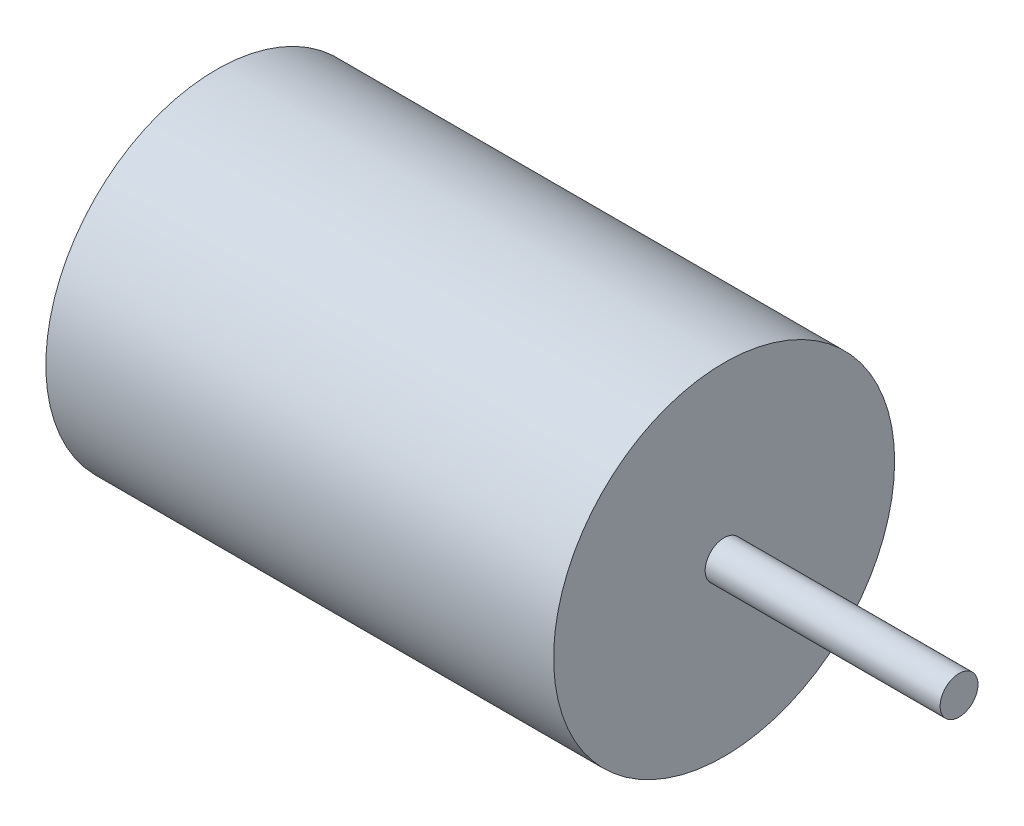
ISO-10303-21;
HEADER;
FILE_DESCRIPTION(('STEP AP214'),'2;1');
FILE_NAME('part.step','',(''),(''),'','','');
FILE_SCHEMA(('AUTOMOTIVE_DESIGN { 1 0 10303 214 1 1 1 1 }'));
ENDSEC;
DATA;
#1=APPLICATION_CONTEXT('core data for automotive mechanical design processes');
#2=APPLICATION_PROTOCOL_DEFINITION('international standard','automotive_design',2000,#1);
#3=PRODUCT_CONTEXT('',#1,'mechanical');
#4=PRODUCT('Part','Part','',(#3));
#5=PRODUCT_RELATED_PRODUCT_CATEGORY('part','',(#4));
#6=PRODUCT_DEFINITION_FORMATION('','',#4);
#7=PRODUCT_DEFINITION_CONTEXT('part definition',#1,'design');
#8=PRODUCT_DEFINITION('design','',#6,#7);
#9=PRODUCT_DEFINITION_SHAPE('','',#8);
#10=(LENGTH_UNIT() NAMED_UNIT(*) SI_UNIT(.MILLI.,.METRE.));
#11=(NAMED_UNIT(*) PLANE_ANGLE_UNIT() SI_UNIT($,.RADIAN.));
#12=(NAMED_UNIT(*) SI_UNIT($,.STERADIAN.) SOLID_ANGLE_UNIT());
#13=UNCERTAINTY_MEASURE_WITH_UNIT(LENGTH_MEASURE(1.E-05),#10,'distance_accuracy_value','');
#14=(GEOMETRIC_REPRESENTATION_CONTEXT(3) GLOBAL_UNCERTAINTY_ASSIGNED_CONTEXT((#13)) GLOBAL_UNIT_ASSIGNED_CONTEXT((#10,
#11,#12)) REPRESENTATION_CONTEXT('',''));
#15=CARTESIAN_POINT('',(0.,0.,0.));
#16=DIRECTION('',(0.,0.,1.));
#17=DIRECTION('',(1.,0.,0.));
#18=AXIS2_PLACEMENT_3D('',#15,#16,#17);
#19=CARTESIAN_POINT('',(67.,0.,0.));
#20=DIRECTION('',(-1.,0.,0.));
#21=DIRECTION('',(0.,0.,1.));
#22=AXIS2_PLACEMENT_3D('',#19,#20,#21);
#23=CYLINDRICAL_SURFACE('',#22,22.5);
#24=CARTESIAN_POINT('',(67.,0.,0.));
#25=DIRECTION('',(1.,0.,0.));
#26=DIRECTION('',(0.,0.,-1.));
#27=AXIS2_PLACEMENT_3D('',#24,#25,#26);
#28=CIRCLE('',#27,22.5);
#29=CARTESIAN_POINT('',(67.,0.,-22.5));
#30=VERTEX_POINT('',#29);
#31=EDGE_CURVE('E10',#30,#30,#28,.T.);
#32=ORIENTED_EDGE('',*,*,#31,.F.);
#33=EDGE_LOOP('',(#32));
#34=FACE_BOUND('',#33,.T.);
#35=CARTESIAN_POINT('',(0.,0.,0.));
#36=DIRECTION('',(1.,0.,0.));
#37=DIRECTION('',(0.,0.,-1.));
#38=AXIS2_PLACEMENT_3D('',#35,#36,#37);
#39=CIRCLE('',#38,22.5);
#40=CARTESIAN_POINT('',(0.,0.,-22.5));
#41=VERTEX_POINT('',#40);
#42=EDGE_CURVE('E40',#41,#41,#39,.T.);
#43=ORIENTED_EDGE('',*,*,#42,.T.);
#44=EDGE_LOOP('',(#43));
#45=FACE_BOUND('',#44,.T.);
#46=ADVANCED_FACE('F37',(#34,#45),#23,.T.);
#47=CARTESIAN_POINT('',(67.,0.,0.));
#48=DIRECTION('',(1.,0.,0.));
#49=DIRECTION('',(0.,0.,-1.));
#50=AXIS2_PLACEMENT_3D('',#47,#48,#49);
#51=PLANE('',#50);
#52=CARTESIAN_POINT('',(67.,0.,0.));
#53=DIRECTION('',(1.,0.,0.));
#54=DIRECTION('',(0.,0.,-1.));
#55=AXIS2_PLACEMENT_3D('',#52,#53,#54);
#56=CIRCLE('',#55,2.5);
#57=CARTESIAN_POINT('',(67.,0.,-2.5));
#58=VERTEX_POINT('',#57);
#59=EDGE_CURVE('E51',#58,#58,#56,.T.);
#60=ORIENTED_EDGE('',*,*,#59,.F.);
#61=EDGE_LOOP('',(#60));
#62=FACE_BOUND('',#61,.T.);
#63=ORIENTED_EDGE('',*,*,#31,.T.);
#64=EDGE_LOOP('',(#63));
#65=FACE_BOUND('',#64,.T.);
#66=ADVANCED_FACE('F68',(#62,#65),#51,.T.);
#67=CARTESIAN_POINT('',(0.,0.,0.));
#68=DIRECTION('',(1.,0.,0.));
#69=DIRECTION('',(0.,0.,-1.));
#70=AXIS2_PLACEMENT_3D('',#67,#68,#69);
#71=PLANE('',#70);
#72=ORIENTED_EDGE('',*,*,#42,.F.);
#73=EDGE_LOOP('',(#72));
#74=FACE_BOUND('',#73,.T.);
#75=ADVANCED_FACE('F64',(#74),#71,.F.);
#76=CARTESIAN_POINT('',(98.,0.,0.));
#77=DIRECTION('',(-1.,0.,0.));
#78=DIRECTION('',(0.,0.,1.));
#79=AXIS2_PLACEMENT_3D('',#76,#77,#78);
#80=CYLINDRICAL_SURFACE('',#79,2.5);
#81=CARTESIAN_POINT('',(98.,0.,0.));
#82=DIRECTION('',(1.,0.,0.));
#83=DIRECTION('',(0.,0.,-1.));
#84=AXIS2_PLACEMENT_3D('',#81,#82,#83);
#85=CIRCLE('',#84,2.5);
#86=CARTESIAN_POINT('',(98.,0.,-2.5));
#87=VERTEX_POINT('',#86);
#88=EDGE_CURVE('E49',#87,#87,#85,.T.);
#89=ORIENTED_EDGE('',*,*,#88,.F.);
#90=EDGE_LOOP('',(#89));
#91=FACE_BOUND('',#90,.T.);
#92=ORIENTED_EDGE('',*,*,#59,.T.);
#93=EDGE_LOOP('',(#92));
#94=FACE_BOUND('',#93,.T.);
#95=ADVANCED_FACE('F61',(#91,#94),#80,.T.);
#96=CARTESIAN_POINT('',(98.,0.,0.));
#97=DIRECTION('',(1.,0.,0.));
#98=DIRECTION('',(0.,0.,-1.));
#99=AXIS2_PLACEMENT_3D('',#96,#97,#98);
#100=PLANE('',#99);
#101=ORIENTED_EDGE('',*,*,#88,.T.);
#102=EDGE_LOOP('',(#101));
#103=FACE_BOUND('',#102,.T.);
#104=ADVANCED_FACE('F59',(#103),#100,.T.);
#105=CLOSED_SHELL('',(#46,#66,#75,#95,#104));
#106=MANIFOLD_SOLID_BREP('B2',#105);
#107=ADVANCED_BREP_SHAPE_REPRESENTATION('',(#18,#106),#14);
#108=SHAPE_DEFINITION_REPRESENTATION(#9,#107);
ENDSEC;
END-ISO-10303-21;
